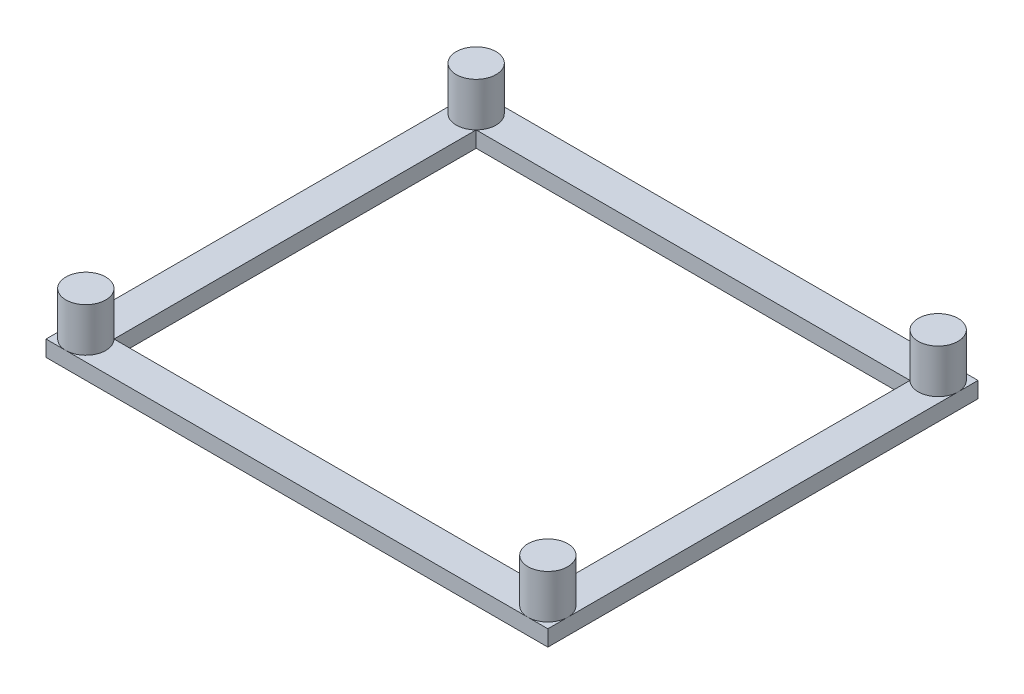
ISO-10303-21;
HEADER;
FILE_DESCRIPTION(('STEP AP214'),'2;1');
FILE_NAME('part.step','',(''),(''),'','','');
FILE_SCHEMA(('AUTOMOTIVE_DESIGN { 1 0 10303 214 1 1 1 1 }'));
ENDSEC;
DATA;
#1=APPLICATION_CONTEXT('core data for automotive mechanical design processes');
#2=APPLICATION_PROTOCOL_DEFINITION('international standard','automotive_design',2000,#1);
#3=PRODUCT_CONTEXT('',#1,'mechanical');
#4=PRODUCT('Part','Part','',(#3));
#5=PRODUCT_RELATED_PRODUCT_CATEGORY('part','',(#4));
#6=PRODUCT_DEFINITION_FORMATION('','',#4);
#7=PRODUCT_DEFINITION_CONTEXT('part definition',#1,'design');
#8=PRODUCT_DEFINITION('design','',#6,#7);
#9=PRODUCT_DEFINITION_SHAPE('','',#8);
#10=(LENGTH_UNIT() NAMED_UNIT(*) SI_UNIT(.MILLI.,.METRE.));
#11=(NAMED_UNIT(*) PLANE_ANGLE_UNIT() SI_UNIT($,.RADIAN.));
#12=(NAMED_UNIT(*) SI_UNIT($,.STERADIAN.) SOLID_ANGLE_UNIT());
#13=UNCERTAINTY_MEASURE_WITH_UNIT(LENGTH_MEASURE(1.E-05),#10,'distance_accuracy_value','');
#14=(GEOMETRIC_REPRESENTATION_CONTEXT(3) GLOBAL_UNCERTAINTY_ASSIGNED_CONTEXT((#13)) GLOBAL_UNIT_ASSIGNED_CONTEXT((#10,
#11,#12)) REPRESENTATION_CONTEXT('',''));
#15=CARTESIAN_POINT('',(0.,0.,0.));
#16=DIRECTION('',(0.,0.,1.));
#17=DIRECTION('',(1.,0.,0.));
#18=AXIS2_PLACEMENT_3D('',#15,#16,#17);
#19=CARTESIAN_POINT('',(0.,2.,0.));
#20=DIRECTION('',(0.,-1.,0.));
#21=DIRECTION('',(0.,0.,-1.));
#22=AXIS2_PLACEMENT_3D('',#19,#20,#21);
#23=PLANE('',#22);
#24=CARTESIAN_POINT('',(58.,2.,-49.));
#25=DIRECTION('',(0.,-1.,0.));
#26=DIRECTION('',(0.,0.,-1.));
#27=AXIS2_PLACEMENT_3D('',#24,#25,#26);
#28=CIRCLE('',#27,2.5);
#29=CARTESIAN_POINT('',(58.,2.,-51.5));
#30=VERTEX_POINT('',#29);
#31=CARTESIAN_POINT('',(56.2322330470336,2.,-47.2322330470336));
#32=VERTEX_POINT('',#31);
#33=EDGE_CURVE('E146',#30,#32,#28,.F.);
#34=ORIENTED_EDGE('',*,*,#33,.F.);
#35=DIRECTION('',(1.,0.,0.));
#36=VECTOR('',#35,1.);
#37=CARTESIAN_POINT('',(-2.5,2.,-51.5));
#38=LINE('',#37,#36);
#39=CARTESIAN_POINT('',(0.,2.,-51.5));
#40=VERTEX_POINT('',#39);
#41=EDGE_CURVE('E128',#40,#30,#38,.T.);
#42=ORIENTED_EDGE('',*,*,#41,.F.);
#43=CARTESIAN_POINT('',(0.,2.,-49.));
#44=DIRECTION('',(0.,-1.,0.));
#45=DIRECTION('',(0.,0.,-1.));
#46=AXIS2_PLACEMENT_3D('',#43,#44,#45);
#47=CIRCLE('',#46,2.5);
#48=CARTESIAN_POINT('',(1.76776695296637,2.,-47.2322330470336));
#49=VERTEX_POINT('',#48);
#50=EDGE_CURVE('E160',#49,#40,#47,.F.);
#51=ORIENTED_EDGE('',*,*,#50,.F.);
#52=DIRECTION('',(1.,0.,0.));
#53=VECTOR('',#52,1.);
#54=CARTESIAN_POINT('',(1.76776695296637,2.,-47.2322330470336));
#55=LINE('',#54,#53);
#56=EDGE_CURVE('E148',#49,#32,#55,.T.);
#57=ORIENTED_EDGE('',*,*,#56,.T.);
#58=EDGE_LOOP('',(#34,#42,#51,#57));
#59=FACE_BOUND('',#58,.T.);
#60=ADVANCED_FACE('F35',(#59),#23,.F.);
#61=CARTESIAN_POINT('',(60.5,2.,-49.));
#62=VERTEX_POINT('',#61);
#63=EDGE_CURVE('E153',#32,#62,#28,.F.);
#64=ORIENTED_EDGE('',*,*,#63,.F.);
#65=DIRECTION('',(0.,0.,1.));
#66=VECTOR('',#65,1.);
#67=CARTESIAN_POINT('',(56.2322330470336,2.,-1.76776695296635));
#68=LINE('',#67,#66);
#69=CARTESIAN_POINT('',(56.2322330470336,2.,-1.76776695296635));
#70=VERTEX_POINT('',#69);
#71=EDGE_CURVE('E172',#32,#70,#68,.T.);
#72=ORIENTED_EDGE('',*,*,#71,.T.);
#73=CARTESIAN_POINT('',(58.,2.,0.));
#74=DIRECTION('',(0.,-1.,0.));
#75=DIRECTION('',(0.,0.,-1.));
#76=AXIS2_PLACEMENT_3D('',#73,#74,#75);
#77=CIRCLE('',#76,2.49999999999999);
#78=CARTESIAN_POINT('',(60.5,2.,0.));
#79=VERTEX_POINT('',#78);
#80=EDGE_CURVE('E39',#70,#79,#77,.T.);
#81=ORIENTED_EDGE('',*,*,#80,.T.);
#82=DIRECTION('',(0.,0.,1.));
#83=VECTOR('',#82,1.);
#84=CARTESIAN_POINT('',(60.5,2.,2.49999999999999));
#85=LINE('',#84,#83);
#86=EDGE_CURVE('E208',#62,#79,#85,.T.);
#87=ORIENTED_EDGE('',*,*,#86,.F.);
#88=EDGE_LOOP('',(#64,#72,#81,#87));
#89=FACE_BOUND('',#88,.T.);
#90=ADVANCED_FACE('F258',(#89),#23,.F.);
#91=CARTESIAN_POINT('',(-2.5,2.,-49.));
#92=VERTEX_POINT('',#91);
#93=EDGE_CURVE('E163',#40,#92,#47,.F.);
#94=ORIENTED_EDGE('',*,*,#93,.F.);
#95=CARTESIAN_POINT('',(-2.5,2.,-51.5));
#96=VERTEX_POINT('',#95);
#97=EDGE_CURVE('E135',#96,#40,#38,.T.);
#98=ORIENTED_EDGE('',*,*,#97,.F.);
#99=DIRECTION('',(0.,0.,-1.));
#100=VECTOR('',#99,1.);
#101=CARTESIAN_POINT('',(-2.5,2.,2.5));
#102=LINE('',#101,#100);
#103=EDGE_CURVE('E203',#92,#96,#102,.T.);
#104=ORIENTED_EDGE('',*,*,#103,.F.);
#105=EDGE_LOOP('',(#94,#98,#104));
#106=FACE_BOUND('',#105,.T.);
#107=ADVANCED_FACE('F288',(#106),#23,.F.);
#108=EDGE_CURVE('E59',#92,#49,#47,.F.);
#109=ORIENTED_EDGE('',*,*,#108,.F.);
#110=CARTESIAN_POINT('',(-2.5,2.,0.));
#111=VERTEX_POINT('',#110);
#112=EDGE_CURVE('E202',#111,#92,#102,.T.);
#113=ORIENTED_EDGE('',*,*,#112,.F.);
#114=CARTESIAN_POINT('',(0.,2.,0.));
#115=DIRECTION('',(0.,-1.,0.));
#116=DIRECTION('',(0.,0.,-1.));
#117=AXIS2_PLACEMENT_3D('',#114,#115,#116);
#118=CIRCLE('',#117,2.5);
#119=CARTESIAN_POINT('',(1.76776695296637,2.,-1.76776695296637));
#120=VERTEX_POINT('',#119);
#121=EDGE_CURVE('E167',#120,#111,#118,.F.);
#122=ORIENTED_EDGE('',*,*,#121,.F.);
#123=DIRECTION('',(0.,0.,-1.));
#124=VECTOR('',#123,1.);
#125=CARTESIAN_POINT('',(1.76776695296637,2.,-47.2322330470336));
#126=LINE('',#125,#124);
#127=EDGE_CURVE('E179',#120,#49,#126,.T.);
#128=ORIENTED_EDGE('',*,*,#127,.T.);
#129=EDGE_LOOP('',(#109,#113,#122,#128));
#130=FACE_BOUND('',#129,.T.);
#131=ADVANCED_FACE('F332',(#130),#23,.F.);
#132=CARTESIAN_POINT('',(0.,2.,2.5));
#133=VERTEX_POINT('',#132);
#134=EDGE_CURVE('E170',#111,#133,#118,.F.);
#135=ORIENTED_EDGE('',*,*,#134,.F.);
#136=CARTESIAN_POINT('',(-2.5,2.,2.5));
#137=VERTEX_POINT('',#136);
#138=EDGE_CURVE('E143',#137,#111,#102,.T.);
#139=ORIENTED_EDGE('',*,*,#138,.F.);
#140=DIRECTION('',(-1.,0.,0.));
#141=VECTOR('',#140,1.);
#142=CARTESIAN_POINT('',(-2.5,2.,2.5));
#143=LINE('',#142,#141);
#144=EDGE_CURVE('E207',#133,#137,#143,.T.);
#145=ORIENTED_EDGE('',*,*,#144,.F.);
#146=EDGE_LOOP('',(#135,#139,#145));
#147=FACE_BOUND('',#146,.T.);
#148=ADVANCED_FACE('F277',(#147),#23,.F.);
#149=EDGE_CURVE('E171',#133,#120,#118,.F.);
#150=ORIENTED_EDGE('',*,*,#149,.F.);
#151=CARTESIAN_POINT('',(58.,2.,2.49999999999999));
#152=VERTEX_POINT('',#151);
#153=EDGE_CURVE('E213',#152,#133,#143,.T.);
#154=ORIENTED_EDGE('',*,*,#153,.F.);
#155=EDGE_CURVE('E11',#152,#70,#77,.T.);
#156=ORIENTED_EDGE('',*,*,#155,.T.);
#157=DIRECTION('',(-1.,0.,0.));
#158=VECTOR('',#157,1.);
#159=CARTESIAN_POINT('',(1.76776695296637,2.,-1.76776695296637));
#160=LINE('',#159,#158);
#161=EDGE_CURVE('E175',#70,#120,#160,.T.);
#162=ORIENTED_EDGE('',*,*,#161,.T.);
#163=EDGE_LOOP('',(#150,#154,#156,#162));
#164=FACE_BOUND('',#163,.T.);
#165=ADVANCED_FACE('F246',(#164),#23,.F.);
#166=CARTESIAN_POINT('',(58.,7.5,0.));
#167=DIRECTION('',(0.,-1.,0.));
#168=DIRECTION('',(0.,0.,-1.));
#169=AXIS2_PLACEMENT_3D('',#166,#167,#168);
#170=CYLINDRICAL_SURFACE('',#169,2.49999999999999);
#171=CARTESIAN_POINT('',(58.,7.5,0.));
#172=DIRECTION('',(0.,1.,0.));
#173=DIRECTION('',(0.,0.,1.));
#174=AXIS2_PLACEMENT_3D('',#171,#172,#173);
#175=CIRCLE('',#174,2.49999999999999);
#176=CARTESIAN_POINT('',(58.,7.5,2.49999999999999));
#177=VERTEX_POINT('',#176);
#178=EDGE_CURVE('E224',#177,#177,#175,.T.);
#179=ORIENTED_EDGE('',*,*,#178,.F.);
#180=EDGE_LOOP('',(#179));
#181=FACE_BOUND('',#180,.T.);
#182=ORIENTED_EDGE('',*,*,#155,.F.);
#183=EDGE_CURVE('E44',#79,#152,#77,.T.);
#184=ORIENTED_EDGE('',*,*,#183,.F.);
#185=ORIENTED_EDGE('',*,*,#80,.F.);
#186=EDGE_LOOP('',(#182,#184,#185));
#187=FACE_BOUND('',#186,.T.);
#188=ADVANCED_FACE('F37',(#181,#187),#170,.T.);
#189=CARTESIAN_POINT('',(0.,7.5,0.));
#190=DIRECTION('',(0.,1.,0.));
#191=DIRECTION('',(0.,0.,1.));
#192=AXIS2_PLACEMENT_3D('',#189,#190,#191);
#193=PLANE('',#192);
#194=ORIENTED_EDGE('',*,*,#178,.T.);
#195=EDGE_LOOP('',(#194));
#196=FACE_BOUND('',#195,.T.);
#197=ADVANCED_FACE('F321',(#196),#193,.T.);
#198=CARTESIAN_POINT('',(60.5,2.,2.49999999999999));
#199=VERTEX_POINT('',#198);
#200=EDGE_CURVE('E205',#79,#199,#85,.T.);
#201=ORIENTED_EDGE('',*,*,#200,.F.);
#202=ORIENTED_EDGE('',*,*,#183,.T.);
#203=EDGE_CURVE('E209',#199,#152,#143,.T.);
#204=ORIENTED_EDGE('',*,*,#203,.F.);
#205=EDGE_LOOP('',(#201,#202,#204));
#206=FACE_BOUND('',#205,.T.);
#207=ADVANCED_FACE('F242',(#206),#23,.F.);
#208=CARTESIAN_POINT('',(-2.5,2.,2.5));
#209=DIRECTION('',(0.,0.,1.));
#210=DIRECTION('',(1.,0.,0.));
#211=AXIS2_PLACEMENT_3D('',#208,#209,#210);
#212=PLANE('',#211);
#213=ORIENTED_EDGE('',*,*,#153,.T.);
#214=ORIENTED_EDGE('',*,*,#144,.T.);
#215=DIRECTION('',(0.,-1.,0.));
#216=VECTOR('',#215,1.);
#217=CARTESIAN_POINT('',(-2.5,2.,2.5));
#218=LINE('',#217,#216);
#219=CARTESIAN_POINT('',(-2.5,0.,2.5));
#220=VERTEX_POINT('',#219);
#221=EDGE_CURVE('E221',#137,#220,#218,.T.);
#222=ORIENTED_EDGE('',*,*,#221,.T.);
#223=DIRECTION('',(-1.,0.,0.));
#224=VECTOR('',#223,1.);
#225=CARTESIAN_POINT('',(-2.5,0.,2.5));
#226=LINE('',#225,#224);
#227=CARTESIAN_POINT('',(60.5,0.,2.49999999999999));
#228=VERTEX_POINT('',#227);
#229=EDGE_CURVE('E219',#228,#220,#226,.T.);
#230=ORIENTED_EDGE('',*,*,#229,.F.);
#231=DIRECTION('',(0.,-1.,0.));
#232=VECTOR('',#231,1.);
#233=CARTESIAN_POINT('',(60.5,2.,2.49999999999999));
#234=LINE('',#233,#232);
#235=EDGE_CURVE('E225',#199,#228,#234,.T.);
#236=ORIENTED_EDGE('',*,*,#235,.F.);
#237=ORIENTED_EDGE('',*,*,#203,.T.);
#238=EDGE_LOOP('',(#213,#214,#222,#230,#236,#237));
#239=FACE_BOUND('',#238,.T.);
#240=ADVANCED_FACE('F253',(#239),#212,.T.);
#241=CARTESIAN_POINT('',(60.5,2.,2.49999999999999));
#242=DIRECTION('',(1.,0.,0.));
#243=DIRECTION('',(0.,0.,-1.));
#244=AXIS2_PLACEMENT_3D('',#241,#242,#243);
#245=PLANE('',#244);
#246=CARTESIAN_POINT('',(60.5,2.,-51.5));
#247=VERTEX_POINT('',#246);
#248=EDGE_CURVE('E142',#247,#62,#85,.T.);
#249=ORIENTED_EDGE('',*,*,#248,.T.);
#250=ORIENTED_EDGE('',*,*,#86,.T.);
#251=ORIENTED_EDGE('',*,*,#200,.T.);
#252=ORIENTED_EDGE('',*,*,#235,.T.);
#253=DIRECTION('',(0.,0.,1.));
#254=VECTOR('',#253,1.);
#255=CARTESIAN_POINT('',(60.5,0.,2.49999999999999));
#256=LINE('',#255,#254);
#257=CARTESIAN_POINT('',(60.5,0.,-51.5));
#258=VERTEX_POINT('',#257);
#259=EDGE_CURVE('E217',#258,#228,#256,.T.);
#260=ORIENTED_EDGE('',*,*,#259,.F.);
#261=DIRECTION('',(0.,-1.,0.));
#262=VECTOR('',#261,1.);
#263=CARTESIAN_POINT('',(60.5,2.,-51.5));
#264=LINE('',#263,#262);
#265=EDGE_CURVE('E228',#247,#258,#264,.T.);
#266=ORIENTED_EDGE('',*,*,#265,.F.);
#267=EDGE_LOOP('',(#249,#250,#251,#252,#260,#266));
#268=FACE_BOUND('',#267,.T.);
#269=ADVANCED_FACE('F257',(#268),#245,.T.);
#270=CARTESIAN_POINT('',(-2.5,2.,2.5));
#271=DIRECTION('',(-1.,0.,0.));
#272=DIRECTION('',(0.,0.,1.));
#273=AXIS2_PLACEMENT_3D('',#270,#271,#272);
#274=PLANE('',#273);
#275=ORIENTED_EDGE('',*,*,#112,.T.);
#276=ORIENTED_EDGE('',*,*,#103,.T.);
#277=DIRECTION('',(0.,-1.,0.));
#278=VECTOR('',#277,1.);
#279=CARTESIAN_POINT('',(-2.5,2.,-51.5));
#280=LINE('',#279,#278);
#281=CARTESIAN_POINT('',(-2.5,0.,-51.5));
#282=VERTEX_POINT('',#281);
#283=EDGE_CURVE('E212',#96,#282,#280,.T.);
#284=ORIENTED_EDGE('',*,*,#283,.T.);
#285=DIRECTION('',(0.,0.,-1.));
#286=VECTOR('',#285,1.);
#287=CARTESIAN_POINT('',(-2.5,0.,2.5));
#288=LINE('',#287,#286);
#289=EDGE_CURVE('E195',#220,#282,#288,.T.);
#290=ORIENTED_EDGE('',*,*,#289,.F.);
#291=ORIENTED_EDGE('',*,*,#221,.F.);
#292=ORIENTED_EDGE('',*,*,#138,.T.);
#293=EDGE_LOOP('',(#275,#276,#284,#290,#291,#292));
#294=FACE_BOUND('',#293,.T.);
#295=ADVANCED_FACE('F282',(#294),#274,.T.);
#296=CARTESIAN_POINT('',(-2.5,2.,-51.5));
#297=DIRECTION('',(0.,0.,-1.));
#298=DIRECTION('',(-1.,0.,0.));
#299=AXIS2_PLACEMENT_3D('',#296,#297,#298);
#300=PLANE('',#299);
#301=ORIENTED_EDGE('',*,*,#41,.T.);
#302=EDGE_CURVE('E131',#30,#247,#38,.T.);
#303=ORIENTED_EDGE('',*,*,#302,.T.);
#304=ORIENTED_EDGE('',*,*,#265,.T.);
#305=DIRECTION('',(1.,0.,0.));
#306=VECTOR('',#305,1.);
#307=CARTESIAN_POINT('',(-2.5,0.,-51.5));
#308=LINE('',#307,#306);
#309=EDGE_CURVE('E215',#282,#258,#308,.T.);
#310=ORIENTED_EDGE('',*,*,#309,.F.);
#311=ORIENTED_EDGE('',*,*,#283,.F.);
#312=ORIENTED_EDGE('',*,*,#97,.T.);
#313=EDGE_LOOP('',(#301,#303,#304,#310,#311,#312));
#314=FACE_BOUND('',#313,.T.);
#315=ADVANCED_FACE('F129',(#314),#300,.T.);
#316=EDGE_CURVE('E51',#62,#30,#28,.F.);
#317=ORIENTED_EDGE('',*,*,#316,.F.);
#318=ORIENTED_EDGE('',*,*,#248,.F.);
#319=ORIENTED_EDGE('',*,*,#302,.F.);
#320=EDGE_LOOP('',(#317,#318,#319));
#321=FACE_BOUND('',#320,.T.);
#322=ADVANCED_FACE('F140',(#321),#23,.F.);
#323=CARTESIAN_POINT('',(56.2322330470336,2.,-1.76776695296635));
#324=DIRECTION('',(1.,0.,0.));
#325=DIRECTION('',(0.,0.,-1.));
#326=AXIS2_PLACEMENT_3D('',#323,#324,#325);
#327=PLANE('',#326);
#328=DIRECTION('',(0.,0.,1.));
#329=VECTOR('',#328,1.);
#330=CARTESIAN_POINT('',(56.2322330470336,0.,-1.76776695296635));
#331=LINE('',#330,#329);
#332=CARTESIAN_POINT('',(56.2322330470336,0.,-47.2322330470336));
#333=VERTEX_POINT('',#332);
#334=CARTESIAN_POINT('',(56.2322330470336,0.,-1.76776695296635));
#335=VERTEX_POINT('',#334);
#336=EDGE_CURVE('E183',#333,#335,#331,.T.);
#337=ORIENTED_EDGE('',*,*,#336,.T.);
#338=DIRECTION('',(0.,-1.,0.));
#339=VECTOR('',#338,1.);
#340=CARTESIAN_POINT('',(56.2322330470336,2.,-1.76776695296635));
#341=LINE('',#340,#339);
#342=EDGE_CURVE('E182',#70,#335,#341,.T.);
#343=ORIENTED_EDGE('',*,*,#342,.F.);
#344=ORIENTED_EDGE('',*,*,#71,.F.);
#345=DIRECTION('',(0.,-1.,0.));
#346=VECTOR('',#345,1.);
#347=CARTESIAN_POINT('',(56.2322330470336,2.,-47.2322330470336));
#348=LINE('',#347,#346);
#349=EDGE_CURVE('E193',#32,#333,#348,.T.);
#350=ORIENTED_EDGE('',*,*,#349,.T.);
#351=EDGE_LOOP('',(#337,#343,#344,#350));
#352=FACE_BOUND('',#351,.T.);
#353=ADVANCED_FACE('F266',(#352),#327,.F.);
#354=CARTESIAN_POINT('',(1.76776695296637,2.,-47.2322330470336));
#355=DIRECTION('',(0.,0.,-1.));
#356=DIRECTION('',(-1.,0.,0.));
#357=AXIS2_PLACEMENT_3D('',#354,#355,#356);
#358=PLANE('',#357);
#359=DIRECTION('',(1.,0.,0.));
#360=VECTOR('',#359,1.);
#361=CARTESIAN_POINT('',(1.76776695296637,0.,-47.2322330470336));
#362=LINE('',#361,#360);
#363=CARTESIAN_POINT('',(1.76776695296637,0.,-47.2322330470336));
#364=VERTEX_POINT('',#363);
#365=EDGE_CURVE('E176',#364,#333,#362,.T.);
#366=ORIENTED_EDGE('',*,*,#365,.T.);
#367=ORIENTED_EDGE('',*,*,#349,.F.);
#368=ORIENTED_EDGE('',*,*,#56,.F.);
#369=DIRECTION('',(0.,-1.,0.));
#370=VECTOR('',#369,1.);
#371=CARTESIAN_POINT('',(1.76776695296637,2.,-47.2322330470336));
#372=LINE('',#371,#370);
#373=EDGE_CURVE('E196',#49,#364,#372,.T.);
#374=ORIENTED_EDGE('',*,*,#373,.T.);
#375=EDGE_LOOP('',(#366,#367,#368,#374));
#376=FACE_BOUND('',#375,.T.);
#377=ADVANCED_FACE('F262',(#376),#358,.F.);
#378=CARTESIAN_POINT('',(1.76776695296637,2.,-47.2322330470336));
#379=DIRECTION('',(-1.,0.,0.));
#380=DIRECTION('',(0.,0.,1.));
#381=AXIS2_PLACEMENT_3D('',#378,#379,#380);
#382=PLANE('',#381);
#383=DIRECTION('',(0.,0.,-1.));
#384=VECTOR('',#383,1.);
#385=CARTESIAN_POINT('',(1.76776695296637,0.,-47.2322330470336));
#386=LINE('',#385,#384);
#387=CARTESIAN_POINT('',(1.76776695296637,0.,-1.76776695296637));
#388=VERTEX_POINT('',#387);
#389=EDGE_CURVE('E188',#388,#364,#386,.T.);
#390=ORIENTED_EDGE('',*,*,#389,.T.);
#391=ORIENTED_EDGE('',*,*,#373,.F.);
#392=ORIENTED_EDGE('',*,*,#127,.F.);
#393=DIRECTION('',(0.,-1.,0.));
#394=VECTOR('',#393,1.);
#395=CARTESIAN_POINT('',(1.76776695296637,2.,-1.76776695296637));
#396=LINE('',#395,#394);
#397=EDGE_CURVE('E198',#120,#388,#396,.T.);
#398=ORIENTED_EDGE('',*,*,#397,.T.);
#399=EDGE_LOOP('',(#390,#391,#392,#398));
#400=FACE_BOUND('',#399,.T.);
#401=ADVANCED_FACE('F295',(#400),#382,.F.);
#402=CARTESIAN_POINT('',(1.76776695296637,2.,-1.76776695296637));
#403=DIRECTION('',(0.,0.,1.));
#404=DIRECTION('',(1.,0.,0.));
#405=AXIS2_PLACEMENT_3D('',#402,#403,#404);
#406=PLANE('',#405);
#407=DIRECTION('',(-1.,0.,0.));
#408=VECTOR('',#407,1.);
#409=CARTESIAN_POINT('',(1.76776695296637,0.,-1.76776695296637));
#410=LINE('',#409,#408);
#411=EDGE_CURVE('E185',#335,#388,#410,.T.);
#412=ORIENTED_EDGE('',*,*,#411,.T.);
#413=ORIENTED_EDGE('',*,*,#397,.F.);
#414=ORIENTED_EDGE('',*,*,#161,.F.);
#415=ORIENTED_EDGE('',*,*,#342,.T.);
#416=EDGE_LOOP('',(#412,#413,#414,#415));
#417=FACE_BOUND('',#416,.T.);
#418=ADVANCED_FACE('F271',(#417),#406,.F.);
#419=CARTESIAN_POINT('',(0.,0.,0.));
#420=DIRECTION('',(0.,1.,0.));
#421=DIRECTION('',(0.,0.,1.));
#422=AXIS2_PLACEMENT_3D('',#419,#420,#421);
#423=PLANE('',#422);
#424=ORIENTED_EDGE('',*,*,#309,.T.);
#425=ORIENTED_EDGE('',*,*,#259,.T.);
#426=ORIENTED_EDGE('',*,*,#229,.T.);
#427=ORIENTED_EDGE('',*,*,#289,.T.);
#428=EDGE_LOOP('',(#424,#425,#426,#427));
#429=FACE_BOUND('',#428,.T.);
#430=ORIENTED_EDGE('',*,*,#336,.F.);
#431=ORIENTED_EDGE('',*,*,#365,.F.);
#432=ORIENTED_EDGE('',*,*,#389,.F.);
#433=ORIENTED_EDGE('',*,*,#411,.F.);
#434=EDGE_LOOP('',(#430,#431,#432,#433));
#435=FACE_BOUND('',#434,.T.);
#436=ADVANCED_FACE('F285',(#429,#435),#423,.F.);
#437=CARTESIAN_POINT('',(0.,7.5,0.));
#438=DIRECTION('',(0.,-1.,0.));
#439=DIRECTION('',(0.,0.,-1.));
#440=AXIS2_PLACEMENT_3D('',#437,#438,#439);
#441=CYLINDRICAL_SURFACE('',#440,2.5);
#442=CARTESIAN_POINT('',(0.,7.5,0.));
#443=DIRECTION('',(0.,1.,0.));
#444=DIRECTION('',(0.,0.,1.));
#445=AXIS2_PLACEMENT_3D('',#442,#443,#444);
#446=CIRCLE('',#445,2.5);
#447=CARTESIAN_POINT('',(0.,7.5,2.5));
#448=VERTEX_POINT('',#447);
#449=EDGE_CURVE('E164',#448,#448,#446,.T.);
#450=ORIENTED_EDGE('',*,*,#449,.F.);
#451=EDGE_LOOP('',(#450));
#452=FACE_BOUND('',#451,.T.);
#453=ORIENTED_EDGE('',*,*,#134,.T.);
#454=ORIENTED_EDGE('',*,*,#149,.T.);
#455=ORIENTED_EDGE('',*,*,#121,.T.);
#456=EDGE_LOOP('',(#453,#454,#455));
#457=FACE_BOUND('',#456,.T.);
#458=ADVANCED_FACE('F273',(#452,#457),#441,.T.);
#459=CARTESIAN_POINT('',(0.,7.5,0.));
#460=DIRECTION('',(0.,1.,0.));
#461=DIRECTION('',(0.,0.,1.));
#462=AXIS2_PLACEMENT_3D('',#459,#460,#461);
#463=PLANE('',#462);
#464=ORIENTED_EDGE('',*,*,#449,.T.);
#465=EDGE_LOOP('',(#464));
#466=FACE_BOUND('',#465,.T.);
#467=ADVANCED_FACE('F302',(#466),#463,.T.);
#468=CARTESIAN_POINT('',(0.,7.5,-49.));
#469=DIRECTION('',(0.,-1.,0.));
#470=DIRECTION('',(0.,0.,-1.));
#471=AXIS2_PLACEMENT_3D('',#468,#469,#470);
#472=CYLINDRICAL_SURFACE('',#471,2.5);
#473=CARTESIAN_POINT('',(0.,7.5,-49.));
#474=DIRECTION('',(0.,1.,0.));
#475=DIRECTION('',(0.,0.,1.));
#476=AXIS2_PLACEMENT_3D('',#473,#474,#475);
#477=CIRCLE('',#476,2.5);
#478=CARTESIAN_POINT('',(0.,7.5,-46.5));
#479=VERTEX_POINT('',#478);
#480=EDGE_CURVE('E151',#479,#479,#477,.T.);
#481=ORIENTED_EDGE('',*,*,#480,.F.);
#482=EDGE_LOOP('',(#481));
#483=FACE_BOUND('',#482,.T.);
#484=ORIENTED_EDGE('',*,*,#93,.T.);
#485=ORIENTED_EDGE('',*,*,#108,.T.);
#486=ORIENTED_EDGE('',*,*,#50,.T.);
#487=EDGE_LOOP('',(#484,#485,#486));
#488=FACE_BOUND('',#487,.T.);
#489=ADVANCED_FACE('F291',(#483,#488),#472,.T.);
#490=CARTESIAN_POINT('',(0.,7.5,0.));
#491=DIRECTION('',(0.,1.,0.));
#492=DIRECTION('',(0.,0.,1.));
#493=AXIS2_PLACEMENT_3D('',#490,#491,#492);
#494=PLANE('',#493);
#495=ORIENTED_EDGE('',*,*,#480,.T.);
#496=EDGE_LOOP('',(#495));
#497=FACE_BOUND('',#496,.T.);
#498=ADVANCED_FACE('F457',(#497),#494,.T.);
#499=CARTESIAN_POINT('',(58.,7.5,-49.));
#500=DIRECTION('',(0.,-1.,0.));
#501=DIRECTION('',(0.,0.,-1.));
#502=AXIS2_PLACEMENT_3D('',#499,#500,#501);
#503=CYLINDRICAL_SURFACE('',#502,2.5);
#504=CARTESIAN_POINT('',(58.,7.5,-49.));
#505=DIRECTION('',(0.,1.,0.));
#506=DIRECTION('',(0.,0.,1.));
#507=AXIS2_PLACEMENT_3D('',#504,#505,#506);
#508=CIRCLE('',#507,2.5);
#509=CARTESIAN_POINT('',(58.,7.5,-46.5));
#510=VERTEX_POINT('',#509);
#511=EDGE_CURVE('E155',#510,#510,#508,.T.);
#512=ORIENTED_EDGE('',*,*,#511,.F.);
#513=EDGE_LOOP('',(#512));
#514=FACE_BOUND('',#513,.T.);
#515=ORIENTED_EDGE('',*,*,#316,.T.);
#516=ORIENTED_EDGE('',*,*,#33,.T.);
#517=ORIENTED_EDGE('',*,*,#63,.T.);
#518=EDGE_LOOP('',(#515,#516,#517));
#519=FACE_BOUND('',#518,.T.);
#520=ADVANCED_FACE('F154',(#514,#519),#503,.T.);
#521=CARTESIAN_POINT('',(0.,7.5,0.));
#522=DIRECTION('',(0.,1.,0.));
#523=DIRECTION('',(0.,0.,1.));
#524=AXIS2_PLACEMENT_3D('',#521,#522,#523);
#525=PLANE('',#524);
#526=ORIENTED_EDGE('',*,*,#511,.T.);
#527=EDGE_LOOP('',(#526));
#528=FACE_BOUND('',#527,.T.);
#529=ADVANCED_FACE('F476',(#528),#525,.T.);
#530=CLOSED_SHELL('',(#60,#90,#107,#131,#148,#165,#188,#197,#207,#240,#269,#295,#315,#322,#353,
#377,#401,#418,#436,#458,#467,#489,#498,#520,#529));
#531=MANIFOLD_SOLID_BREP('B2',#530);
#532=ADVANCED_BREP_SHAPE_REPRESENTATION('',(#18,#531),#14);
#533=SHAPE_DEFINITION_REPRESENTATION(#9,#532);
ENDSEC;
END-ISO-10303-21;
